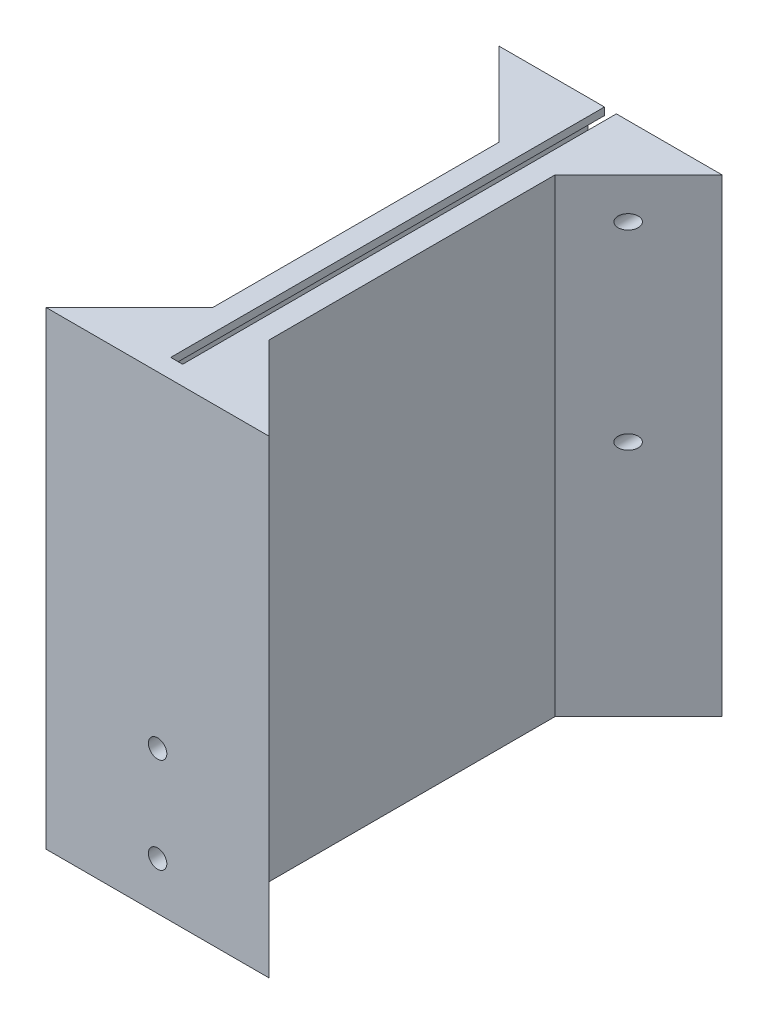
ISO-10303-21;
HEADER;
FILE_DESCRIPTION(('STEP AP214'),'2;1');
FILE_NAME('part.step','',(''),(''),'','','');
FILE_SCHEMA(('AUTOMOTIVE_DESIGN { 1 0 10303 214 1 1 1 1 }'));
ENDSEC;
DATA;
#1=APPLICATION_CONTEXT('core data for automotive mechanical design processes');
#2=APPLICATION_PROTOCOL_DEFINITION('international standard','automotive_design',2000,#1);
#3=PRODUCT_CONTEXT('',#1,'mechanical');
#4=PRODUCT('Part','Part','',(#3));
#5=PRODUCT_RELATED_PRODUCT_CATEGORY('part','',(#4));
#6=PRODUCT_DEFINITION_FORMATION('','',#4);
#7=PRODUCT_DEFINITION_CONTEXT('part definition',#1,'design');
#8=PRODUCT_DEFINITION('design','',#6,#7);
#9=PRODUCT_DEFINITION_SHAPE('','',#8);
#10=(LENGTH_UNIT() NAMED_UNIT(*) SI_UNIT(.MILLI.,.METRE.));
#11=(NAMED_UNIT(*) PLANE_ANGLE_UNIT() SI_UNIT($,.RADIAN.));
#12=(NAMED_UNIT(*) SI_UNIT($,.STERADIAN.) SOLID_ANGLE_UNIT());
#13=UNCERTAINTY_MEASURE_WITH_UNIT(LENGTH_MEASURE(1.E-05),#10,'distance_accuracy_value','');
#14=(GEOMETRIC_REPRESENTATION_CONTEXT(3) GLOBAL_UNCERTAINTY_ASSIGNED_CONTEXT((#13)) GLOBAL_UNIT_ASSIGNED_CONTEXT((#10,
#11,#12)) REPRESENTATION_CONTEXT('',''));
#15=CARTESIAN_POINT('',(0.,0.,0.));
#16=DIRECTION('',(0.,0.,1.));
#17=DIRECTION('',(1.,0.,0.));
#18=AXIS2_PLACEMENT_3D('',#15,#16,#17);
#19=CARTESIAN_POINT('',(-5.99999999999999,123.,55.245));
#20=DIRECTION('',(0.,1.,0.));
#21=DIRECTION('',(0.,0.,1.));
#22=AXIS2_PLACEMENT_3D('',#19,#20,#21);
#23=PLANE('',#22);
#24=DIRECTION('',(1.,0.,0.));
#25=VECTOR('',#24,1.);
#26=CARTESIAN_POINT('',(-5.99999999999999,123.,55.245));
#27=LINE('',#26,#25);
#28=CARTESIAN_POINT('',(1.58750000000001,123.,55.245));
#29=VERTEX_POINT('',#28);
#30=CARTESIAN_POINT('',(6.00000000000001,123.,55.245));
#31=VERTEX_POINT('',#30);
#32=EDGE_CURVE('E224',#29,#31,#27,.T.);
#33=ORIENTED_EDGE('',*,*,#32,.F.);
#34=DIRECTION('',(0.,0.,-1.));
#35=VECTOR('',#34,1.);
#36=CARTESIAN_POINT('',(1.58750000000001,123.,55.245));
#37=LINE('',#36,#35);
#38=CARTESIAN_POINT('',(1.58750000000001,123.,-60.325));
#39=VERTEX_POINT('',#38);
#40=EDGE_CURVE('E216',#29,#39,#37,.T.);
#41=ORIENTED_EDGE('',*,*,#40,.T.);
#42=DIRECTION('',(1.,0.,0.));
#43=VECTOR('',#42,1.);
#44=CARTESIAN_POINT('',(-5.99999999999999,123.,-60.325));
#45=LINE('',#44,#43);
#46=CARTESIAN_POINT('',(6.00000000000001,123.,-60.325));
#47=VERTEX_POINT('',#46);
#48=EDGE_CURVE('E219',#39,#47,#45,.T.);
#49=ORIENTED_EDGE('',*,*,#48,.T.);
#50=DIRECTION('',(0.,0.,-1.));
#51=VECTOR('',#50,1.);
#52=CARTESIAN_POINT('',(6.00000000000001,123.,55.245));
#53=LINE('',#52,#51);
#54=EDGE_CURVE('E233',#31,#47,#53,.T.);
#55=ORIENTED_EDGE('',*,*,#54,.F.);
#56=EDGE_LOOP('',(#33,#41,#49,#55));
#57=FACE_BOUND('',#56,.T.);
#58=ADVANCED_FACE('F32',(#57),#23,.F.);
#59=CARTESIAN_POINT('',(-7.5,125.,38.1));
#60=DIRECTION('',(0.707106781186547,0.,0.707106781186548));
#61=DIRECTION('',(0.707106781186548,0.,-0.707106781186547));
#62=AXIS2_PLACEMENT_3D('',#59,#60,#61);
#63=PLANE('',#62);
#64=DIRECTION('',(-0.707106781186548,0.,0.707106781186547));
#65=VECTOR('',#64,1.);
#66=CARTESIAN_POINT('',(-7.5,0.,38.1));
#67=LINE('',#66,#65);
#68=CARTESIAN_POINT('',(-7.5,0.,38.1));
#69=VERTEX_POINT('',#68);
#70=CARTESIAN_POINT('',(-29.725,0.,60.325));
#71=VERTEX_POINT('',#70);
#72=EDGE_CURVE('E248',#69,#71,#67,.T.);
#73=ORIENTED_EDGE('',*,*,#72,.T.);
#74=DIRECTION('',(0.,-1.,0.));
#75=VECTOR('',#74,1.);
#76=CARTESIAN_POINT('',(-29.725,125.,60.325));
#77=LINE('',#76,#75);
#78=CARTESIAN_POINT('',(-29.725,125.,60.325));
#79=VERTEX_POINT('',#78);
#80=EDGE_CURVE('E11',#79,#71,#77,.T.);
#81=ORIENTED_EDGE('',*,*,#80,.F.);
#82=DIRECTION('',(-0.707106781186548,0.,0.707106781186547));
#83=VECTOR('',#82,1.);
#84=CARTESIAN_POINT('',(-7.5,125.,38.1));
#85=LINE('',#84,#83);
#86=CARTESIAN_POINT('',(-7.5,125.,38.1));
#87=VERTEX_POINT('',#86);
#88=EDGE_CURVE('E255',#87,#79,#85,.T.);
#89=ORIENTED_EDGE('',*,*,#88,.F.);
#90=DIRECTION('',(0.,-1.,0.));
#91=VECTOR('',#90,1.);
#92=CARTESIAN_POINT('',(-7.5,125.,38.1));
#93=LINE('',#92,#91);
#94=EDGE_CURVE('E275',#87,#69,#93,.T.);
#95=ORIENTED_EDGE('',*,*,#94,.T.);
#96=EDGE_LOOP('',(#73,#81,#89,#95));
#97=FACE_BOUND('',#96,.T.);
#98=ADVANCED_FACE('F34',(#97),#63,.F.);
#99=CARTESIAN_POINT('',(-29.725,125.,60.325));
#100=DIRECTION('',(0.,0.,-1.));
#101=DIRECTION('',(-1.,0.,0.));
#102=AXIS2_PLACEMENT_3D('',#99,#100,#101);
#103=PLANE('',#102);
#104=CARTESIAN_POINT('',(0.,12.7,60.325));
#105=DIRECTION('',(0.,0.,1.));
#106=DIRECTION('',(1.,0.,0.));
#107=AXIS2_PLACEMENT_3D('',#104,#105,#106);
#108=CIRCLE('',#107,2.45745);
#109=CARTESIAN_POINT('',(2.45745,12.7,60.325));
#110=VERTEX_POINT('',#109);
#111=EDGE_CURVE('E427',#110,#110,#108,.T.);
#112=ORIENTED_EDGE('',*,*,#111,.F.);
#113=EDGE_LOOP('',(#112));
#114=FACE_BOUND('',#113,.T.);
#115=CARTESIAN_POINT('',(0.,38.1,60.325));
#116=DIRECTION('',(0.,0.,1.));
#117=DIRECTION('',(1.,0.,0.));
#118=AXIS2_PLACEMENT_3D('',#115,#116,#117);
#119=CIRCLE('',#118,2.45745);
#120=CARTESIAN_POINT('',(2.45745,38.1,60.325));
#121=VERTEX_POINT('',#120);
#122=EDGE_CURVE('E430',#121,#121,#119,.T.);
#123=ORIENTED_EDGE('',*,*,#122,.F.);
#124=EDGE_LOOP('',(#123));
#125=FACE_BOUND('',#124,.T.);
#126=DIRECTION('',(1.,0.,0.));
#127=VECTOR('',#126,1.);
#128=CARTESIAN_POINT('',(-29.725,0.,60.325));
#129=LINE('',#128,#127);
#130=CARTESIAN_POINT('',(29.725,0.,60.325));
#131=VERTEX_POINT('',#130);
#132=EDGE_CURVE('E278',#71,#131,#129,.T.);
#133=ORIENTED_EDGE('',*,*,#132,.T.);
#134=DIRECTION('',(0.,-1.,0.));
#135=VECTOR('',#134,1.);
#136=CARTESIAN_POINT('',(29.725,125.,60.325));
#137=LINE('',#136,#135);
#138=CARTESIAN_POINT('',(29.725,125.,60.325));
#139=VERTEX_POINT('',#138);
#140=EDGE_CURVE('E40',#139,#131,#137,.T.);
#141=ORIENTED_EDGE('',*,*,#140,.F.);
#142=DIRECTION('',(1.,0.,0.));
#143=VECTOR('',#142,1.);
#144=CARTESIAN_POINT('',(-29.725,125.,60.325));
#145=LINE('',#144,#143);
#146=EDGE_CURVE('E258',#79,#139,#145,.T.);
#147=ORIENTED_EDGE('',*,*,#146,.F.);
#148=ORIENTED_EDGE('',*,*,#80,.T.);
#149=EDGE_LOOP('',(#133,#141,#147,#148));
#150=FACE_BOUND('',#149,.T.);
#151=ADVANCED_FACE('F335',(#114,#125,#150),#103,.F.);
#152=CARTESIAN_POINT('',(29.725,125.,60.325));
#153=DIRECTION('',(-0.707106781186548,0.,0.707106781186547));
#154=DIRECTION('',(0.707106781186547,0.,0.707106781186548));
#155=AXIS2_PLACEMENT_3D('',#152,#153,#154);
#156=PLANE('',#155);
#157=DIRECTION('',(-0.707106781186547,0.,-0.707106781186548));
#158=VECTOR('',#157,1.);
#159=CARTESIAN_POINT('',(29.725,0.,60.325));
#160=LINE('',#159,#158);
#161=CARTESIAN_POINT('',(7.5,0.,38.1));
#162=VERTEX_POINT('',#161);
#163=EDGE_CURVE('E280',#131,#162,#160,.T.);
#164=ORIENTED_EDGE('',*,*,#163,.T.);
#165=DIRECTION('',(0.,-1.,0.));
#166=VECTOR('',#165,1.);
#167=CARTESIAN_POINT('',(7.5,125.,38.1));
#168=LINE('',#167,#166);
#169=CARTESIAN_POINT('',(7.5,125.,38.1));
#170=VERTEX_POINT('',#169);
#171=EDGE_CURVE('E305',#170,#162,#168,.T.);
#172=ORIENTED_EDGE('',*,*,#171,.F.);
#173=DIRECTION('',(-0.707106781186547,0.,-0.707106781186548));
#174=VECTOR('',#173,1.);
#175=CARTESIAN_POINT('',(29.725,125.,60.325));
#176=LINE('',#175,#174);
#177=EDGE_CURVE('E261',#139,#170,#176,.T.);
#178=ORIENTED_EDGE('',*,*,#177,.F.);
#179=ORIENTED_EDGE('',*,*,#140,.T.);
#180=EDGE_LOOP('',(#164,#172,#178,#179));
#181=FACE_BOUND('',#180,.T.);
#182=ADVANCED_FACE('F312',(#181),#156,.F.);
#183=CARTESIAN_POINT('',(7.5,125.,38.1));
#184=DIRECTION('',(-1.,0.,0.));
#185=DIRECTION('',(0.,0.,1.));
#186=AXIS2_PLACEMENT_3D('',#183,#184,#185);
#187=PLANE('',#186);
#188=DIRECTION('',(0.,0.,-1.));
#189=VECTOR('',#188,1.);
#190=CARTESIAN_POINT('',(7.5,0.,38.1));
#191=LINE('',#190,#189);
#192=CARTESIAN_POINT('',(7.5,0.,-38.1));
#193=VERTEX_POINT('',#192);
#194=EDGE_CURVE('E282',#162,#193,#191,.T.);
#195=ORIENTED_EDGE('',*,*,#194,.T.);
#196=DIRECTION('',(0.,-1.,0.));
#197=VECTOR('',#196,1.);
#198=CARTESIAN_POINT('',(7.5,125.,-38.1));
#199=LINE('',#198,#197);
#200=CARTESIAN_POINT('',(7.5,125.,-38.1));
#201=VERTEX_POINT('',#200);
#202=EDGE_CURVE('E302',#201,#193,#199,.T.);
#203=ORIENTED_EDGE('',*,*,#202,.F.);
#204=DIRECTION('',(0.,0.,-1.));
#205=VECTOR('',#204,1.);
#206=CARTESIAN_POINT('',(7.5,125.,38.1));
#207=LINE('',#206,#205);
#208=EDGE_CURVE('E263',#170,#201,#207,.T.);
#209=ORIENTED_EDGE('',*,*,#208,.F.);
#210=ORIENTED_EDGE('',*,*,#171,.T.);
#211=EDGE_LOOP('',(#195,#203,#209,#210));
#212=FACE_BOUND('',#211,.T.);
#213=ADVANCED_FACE('F323',(#212),#187,.F.);
#214=CARTESIAN_POINT('',(7.5,125.,-38.1));
#215=DIRECTION('',(-0.707106781186547,0.,-0.707106781186548));
#216=DIRECTION('',(-0.707106781186548,0.,0.707106781186547));
#217=AXIS2_PLACEMENT_3D('',#214,#215,#216);
#218=PLANE('',#217);
#219=CARTESIAN_POINT('',(17.225,114.15,-47.825));
#220=DIRECTION('',(-0.707106781186547,0.,-0.707106781186548));
#221=DIRECTION('',(0.707106781186548,0.,-0.707106781186547));
#222=AXIS2_PLACEMENT_3D('',#219,#220,#221);
#223=ELLIPSE('',#222,2.68509658019967,1.89864999999999);
#224=CARTESIAN_POINT('',(19.12365,114.15,-49.72365));
#225=VERTEX_POINT('',#224);
#226=EDGE_CURVE('E662',#225,#225,#223,.T.);
#227=ORIENTED_EDGE('',*,*,#226,.T.);
#228=EDGE_LOOP('',(#227));
#229=FACE_BOUND('',#228,.T.);
#230=CARTESIAN_POINT('',(17.225,63.35,-47.825));
#231=DIRECTION('',(-0.707106781186547,0.,-0.707106781186548));
#232=DIRECTION('',(0.707106781186548,0.,-0.707106781186547));
#233=AXIS2_PLACEMENT_3D('',#230,#231,#232);
#234=ELLIPSE('',#233,2.68509658019967,1.89864999999999);
#235=CARTESIAN_POINT('',(19.12365,63.35,-49.72365));
#236=VERTEX_POINT('',#235);
#237=EDGE_CURVE('E666',#236,#236,#234,.T.);
#238=ORIENTED_EDGE('',*,*,#237,.T.);
#239=EDGE_LOOP('',(#238));
#240=FACE_BOUND('',#239,.T.);
#241=DIRECTION('',(0.707106781186548,0.,-0.707106781186547));
#242=VECTOR('',#241,1.);
#243=CARTESIAN_POINT('',(7.5,0.,-38.1));
#244=LINE('',#243,#242);
#245=CARTESIAN_POINT('',(29.725,0.,-60.325));
#246=VERTEX_POINT('',#245);
#247=EDGE_CURVE('E284',#193,#246,#244,.T.);
#248=ORIENTED_EDGE('',*,*,#247,.T.);
#249=DIRECTION('',(0.,-1.,0.));
#250=VECTOR('',#249,1.);
#251=CARTESIAN_POINT('',(29.725,125.,-60.325));
#252=LINE('',#251,#250);
#253=CARTESIAN_POINT('',(29.725,125.,-60.325));
#254=VERTEX_POINT('',#253);
#255=EDGE_CURVE('E299',#254,#246,#252,.T.);
#256=ORIENTED_EDGE('',*,*,#255,.F.);
#257=DIRECTION('',(0.707106781186548,0.,-0.707106781186547));
#258=VECTOR('',#257,1.);
#259=CARTESIAN_POINT('',(7.5,125.,-38.1));
#260=LINE('',#259,#258);
#261=EDGE_CURVE('E265',#201,#254,#260,.T.);
#262=ORIENTED_EDGE('',*,*,#261,.F.);
#263=ORIENTED_EDGE('',*,*,#202,.T.);
#264=EDGE_LOOP('',(#248,#256,#262,#263));
#265=FACE_BOUND('',#264,.T.);
#266=ADVANCED_FACE('F327',(#229,#240,#265),#218,.F.);
#267=CARTESIAN_POINT('',(29.725,125.,-60.325));
#268=DIRECTION('',(0.,0.,1.));
#269=DIRECTION('',(1.,0.,0.));
#270=AXIS2_PLACEMENT_3D('',#267,#268,#269);
#271=PLANE('',#270);
#272=CARTESIAN_POINT('',(17.225,114.15,-60.325));
#273=DIRECTION('',(0.,0.,-1.));
#274=DIRECTION('',(-1.,0.,0.));
#275=AXIS2_PLACEMENT_3D('',#272,#273,#274);
#276=CIRCLE('',#275,1.89864999999999);
#277=CARTESIAN_POINT('',(15.32635,114.15,-60.325));
#278=VERTEX_POINT('',#277);
#279=EDGE_CURVE('E659',#278,#278,#276,.T.);
#280=ORIENTED_EDGE('',*,*,#279,.F.);
#281=EDGE_LOOP('',(#280));
#282=FACE_BOUND('',#281,.T.);
#283=CARTESIAN_POINT('',(17.225,63.35,-60.325));
#284=DIRECTION('',(0.,0.,-1.));
#285=DIRECTION('',(-1.,0.,0.));
#286=AXIS2_PLACEMENT_3D('',#283,#284,#285);
#287=CIRCLE('',#286,1.89864999999999);
#288=CARTESIAN_POINT('',(15.32635,63.35,-60.325));
#289=VERTEX_POINT('',#288);
#290=EDGE_CURVE('E663',#289,#289,#287,.T.);
#291=ORIENTED_EDGE('',*,*,#290,.F.);
#292=EDGE_LOOP('',(#291));
#293=FACE_BOUND('',#292,.T.);
#294=CARTESIAN_POINT('',(-17.225,114.15,-60.325));
#295=DIRECTION('',(0.,0.,-1.));
#296=DIRECTION('',(-1.,0.,0.));
#297=AXIS2_PLACEMENT_3D('',#294,#295,#296);
#298=CIRCLE('',#297,1.89864999999999);
#299=CARTESIAN_POINT('',(-19.1236499999999,114.15,-60.325));
#300=VERTEX_POINT('',#299);
#301=EDGE_CURVE('E672',#300,#300,#298,.T.);
#302=ORIENTED_EDGE('',*,*,#301,.F.);
#303=EDGE_LOOP('',(#302));
#304=FACE_BOUND('',#303,.T.);
#305=CARTESIAN_POINT('',(-17.225,63.35,-60.325));
#306=DIRECTION('',(0.,0.,-1.));
#307=DIRECTION('',(-1.,0.,0.));
#308=AXIS2_PLACEMENT_3D('',#305,#306,#307);
#309=CIRCLE('',#308,1.89864999999999);
#310=CARTESIAN_POINT('',(-19.1236499999999,63.35,-60.325));
#311=VERTEX_POINT('',#310);
#312=EDGE_CURVE('E678',#311,#311,#309,.T.);
#313=ORIENTED_EDGE('',*,*,#312,.F.);
#314=EDGE_LOOP('',(#313));
#315=FACE_BOUND('',#314,.T.);
#316=CARTESIAN_POINT('',(0.,38.1,-60.325));
#317=DIRECTION('',(0.,0.,-1.));
#318=DIRECTION('',(-1.,0.,0.));
#319=AXIS2_PLACEMENT_3D('',#316,#317,#318);
#320=CIRCLE('',#319,2.45745);
#321=CARTESIAN_POINT('',(-2.45745,38.1,-60.325));
#322=VERTEX_POINT('',#321);
#323=EDGE_CURVE('E436',#322,#322,#320,.T.);
#324=ORIENTED_EDGE('',*,*,#323,.F.);
#325=EDGE_LOOP('',(#324));
#326=FACE_BOUND('',#325,.T.);
#327=CARTESIAN_POINT('',(0.,12.7,-60.325));
#328=DIRECTION('',(0.,0.,-1.));
#329=DIRECTION('',(-1.,0.,0.));
#330=AXIS2_PLACEMENT_3D('',#327,#328,#329);
#331=CIRCLE('',#330,2.45745);
#332=CARTESIAN_POINT('',(-2.45745,12.7,-60.325));
#333=VERTEX_POINT('',#332);
#334=EDGE_CURVE('E445',#333,#333,#331,.T.);
#335=ORIENTED_EDGE('',*,*,#334,.F.);
#336=EDGE_LOOP('',(#335));
#337=FACE_BOUND('',#336,.T.);
#338=ORIENTED_EDGE('',*,*,#48,.F.);
#339=DIRECTION('',(0.,1.,0.));
#340=VECTOR('',#339,1.);
#341=CARTESIAN_POINT('',(1.58750000000001,122.,-60.325));
#342=LINE('',#341,#340);
#343=CARTESIAN_POINT('',(1.58750000000001,125.,-60.325));
#344=VERTEX_POINT('',#343);
#345=EDGE_CURVE('E205',#39,#344,#342,.T.);
#346=ORIENTED_EDGE('',*,*,#345,.T.);
#347=DIRECTION('',(-1.,0.,0.));
#348=VECTOR('',#347,1.);
#349=CARTESIAN_POINT('',(29.725,125.,-60.325));
#350=LINE('',#349,#348);
#351=EDGE_CURVE('E268',#254,#344,#350,.T.);
#352=ORIENTED_EDGE('',*,*,#351,.F.);
#353=ORIENTED_EDGE('',*,*,#255,.T.);
#354=DIRECTION('',(-1.,0.,0.));
#355=VECTOR('',#354,1.);
#356=CARTESIAN_POINT('',(29.725,0.,-60.325));
#357=LINE('',#356,#355);
#358=CARTESIAN_POINT('',(-29.725,0.,-60.325));
#359=VERTEX_POINT('',#358);
#360=EDGE_CURVE('E286',#246,#359,#357,.T.);
#361=ORIENTED_EDGE('',*,*,#360,.T.);
#362=DIRECTION('',(0.,-1.,0.));
#363=VECTOR('',#362,1.);
#364=CARTESIAN_POINT('',(-29.725,125.,-60.325));
#365=LINE('',#364,#363);
#366=CARTESIAN_POINT('',(-29.725,125.,-60.325));
#367=VERTEX_POINT('',#366);
#368=EDGE_CURVE('E296',#367,#359,#365,.T.);
#369=ORIENTED_EDGE('',*,*,#368,.F.);
#370=CARTESIAN_POINT('',(-1.58750000000001,125.,-60.325));
#371=VERTEX_POINT('',#370);
#372=EDGE_CURVE('E267',#371,#367,#350,.T.);
#373=ORIENTED_EDGE('',*,*,#372,.F.);
#374=DIRECTION('',(0.,1.,0.));
#375=VECTOR('',#374,1.);
#376=CARTESIAN_POINT('',(-1.58750000000001,122.,-60.325));
#377=LINE('',#376,#375);
#378=CARTESIAN_POINT('',(-1.58750000000001,123.,-60.325));
#379=VERTEX_POINT('',#378);
#380=EDGE_CURVE('E204',#379,#371,#377,.T.);
#381=ORIENTED_EDGE('',*,*,#380,.F.);
#382=CARTESIAN_POINT('',(-5.99999999999999,123.,-60.325));
#383=VERTEX_POINT('',#382);
#384=EDGE_CURVE('E234',#383,#379,#45,.T.);
#385=ORIENTED_EDGE('',*,*,#384,.F.);
#386=DIRECTION('',(0.,1.,0.));
#387=VECTOR('',#386,1.);
#388=CARTESIAN_POINT('',(-5.99999999999999,55.,-60.325));
#389=LINE('',#388,#387);
#390=CARTESIAN_POINT('',(-5.99999999999999,55.,-60.325));
#391=VERTEX_POINT('',#390);
#392=EDGE_CURVE('E243',#391,#383,#389,.T.);
#393=ORIENTED_EDGE('',*,*,#392,.F.);
#394=DIRECTION('',(-1.,0.,0.));
#395=VECTOR('',#394,1.);
#396=CARTESIAN_POINT('',(6.00000000000001,55.,-60.325));
#397=LINE('',#396,#395);
#398=CARTESIAN_POINT('',(6.00000000000001,55.,-60.325));
#399=VERTEX_POINT('',#398);
#400=EDGE_CURVE('E240',#399,#391,#397,.T.);
#401=ORIENTED_EDGE('',*,*,#400,.F.);
#402=DIRECTION('',(0.,-1.,0.));
#403=VECTOR('',#402,1.);
#404=CARTESIAN_POINT('',(6.00000000000001,123.,-60.325));
#405=LINE('',#404,#403);
#406=EDGE_CURVE('E237',#47,#399,#405,.T.);
#407=ORIENTED_EDGE('',*,*,#406,.F.);
#408=EDGE_LOOP('',(#338,#346,#352,#353,#361,#369,#373,#381,#385,#393,#401,#407));
#409=FACE_BOUND('',#408,.T.);
#410=ADVANCED_FACE('F351',(#282,#293,#304,#315,#326,#337,#409),#271,.F.);
#411=CARTESIAN_POINT('',(-29.725,125.,-60.325));
#412=DIRECTION('',(0.707106781186548,0.,-0.707106781186547));
#413=DIRECTION('',(-0.707106781186547,0.,-0.707106781186548));
#414=AXIS2_PLACEMENT_3D('',#411,#412,#413);
#415=PLANE('',#414);
#416=CARTESIAN_POINT('',(-17.225,114.15,-47.825));
#417=DIRECTION('',(0.707106781186548,0.,-0.707106781186547));
#418=DIRECTION('',(-0.707106781186547,0.,-0.707106781186548));
#419=AXIS2_PLACEMENT_3D('',#416,#417,#418);
#420=ELLIPSE('',#419,2.68509658019967,1.89864999999999);
#421=CARTESIAN_POINT('',(-19.1236499999999,114.15,-49.72365));
#422=VERTEX_POINT('',#421);
#423=EDGE_CURVE('E675',#422,#422,#420,.T.);
#424=ORIENTED_EDGE('',*,*,#423,.T.);
#425=EDGE_LOOP('',(#424));
#426=FACE_BOUND('',#425,.T.);
#427=CARTESIAN_POINT('',(-17.225,63.35,-47.825));
#428=DIRECTION('',(0.707106781186548,0.,-0.707106781186547));
#429=DIRECTION('',(-0.707106781186547,0.,-0.707106781186548));
#430=AXIS2_PLACEMENT_3D('',#427,#428,#429);
#431=ELLIPSE('',#430,2.68509658019967,1.89864999999999);
#432=CARTESIAN_POINT('',(-19.1236499999999,63.35,-49.72365));
#433=VERTEX_POINT('',#432);
#434=EDGE_CURVE('E681',#433,#433,#431,.T.);
#435=ORIENTED_EDGE('',*,*,#434,.T.);
#436=EDGE_LOOP('',(#435));
#437=FACE_BOUND('',#436,.T.);
#438=DIRECTION('',(0.707106781186547,0.,0.707106781186548));
#439=VECTOR('',#438,1.);
#440=CARTESIAN_POINT('',(-29.725,0.,-60.325));
#441=LINE('',#440,#439);
#442=CARTESIAN_POINT('',(-7.5,0.,-38.1));
#443=VERTEX_POINT('',#442);
#444=EDGE_CURVE('E288',#359,#443,#441,.T.);
#445=ORIENTED_EDGE('',*,*,#444,.T.);
#446=DIRECTION('',(0.,-1.,0.));
#447=VECTOR('',#446,1.);
#448=CARTESIAN_POINT('',(-7.5,125.,-38.1));
#449=LINE('',#448,#447);
#450=CARTESIAN_POINT('',(-7.5,125.,-38.1));
#451=VERTEX_POINT('',#450);
#452=EDGE_CURVE('E293',#451,#443,#449,.T.);
#453=ORIENTED_EDGE('',*,*,#452,.F.);
#454=DIRECTION('',(0.707106781186547,0.,0.707106781186548));
#455=VECTOR('',#454,1.);
#456=CARTESIAN_POINT('',(-29.725,125.,-60.325));
#457=LINE('',#456,#455);
#458=EDGE_CURVE('E271',#367,#451,#457,.T.);
#459=ORIENTED_EDGE('',*,*,#458,.F.);
#460=ORIENTED_EDGE('',*,*,#368,.T.);
#461=EDGE_LOOP('',(#445,#453,#459,#460));
#462=FACE_BOUND('',#461,.T.);
#463=ADVANCED_FACE('F346',(#426,#437,#462),#415,.F.);
#464=CARTESIAN_POINT('',(-7.5,125.,-38.1));
#465=DIRECTION('',(1.,0.,0.));
#466=DIRECTION('',(0.,0.,-1.));
#467=AXIS2_PLACEMENT_3D('',#464,#465,#466);
#468=PLANE('',#467);
#469=DIRECTION('',(0.,0.,1.));
#470=VECTOR('',#469,1.);
#471=CARTESIAN_POINT('',(-7.5,0.,-38.1));
#472=LINE('',#471,#470);
#473=EDGE_CURVE('E259',#443,#69,#472,.T.);
#474=ORIENTED_EDGE('',*,*,#473,.T.);
#475=ORIENTED_EDGE('',*,*,#94,.F.);
#476=DIRECTION('',(0.,0.,1.));
#477=VECTOR('',#476,1.);
#478=CARTESIAN_POINT('',(-7.5,125.,-38.1));
#479=LINE('',#478,#477);
#480=EDGE_CURVE('E273',#451,#87,#479,.T.);
#481=ORIENTED_EDGE('',*,*,#480,.F.);
#482=ORIENTED_EDGE('',*,*,#452,.T.);
#483=EDGE_LOOP('',(#474,#475,#481,#482));
#484=FACE_BOUND('',#483,.T.);
#485=ADVANCED_FACE('F341',(#484),#468,.F.);
#486=CARTESIAN_POINT('',(0.,125.,0.));
#487=DIRECTION('',(0.,-1.,0.));
#488=DIRECTION('',(0.,0.,-1.));
#489=AXIS2_PLACEMENT_3D('',#486,#487,#488);
#490=PLANE('',#489);
#491=ORIENTED_EDGE('',*,*,#351,.T.);
#492=DIRECTION('',(0.,0.,-1.));
#493=VECTOR('',#492,1.);
#494=CARTESIAN_POINT('',(1.58750000000001,125.,55.245));
#495=LINE('',#494,#493);
#496=CARTESIAN_POINT('',(1.58750000000001,125.,55.245));
#497=VERTEX_POINT('',#496);
#498=EDGE_CURVE('E202',#497,#344,#495,.T.);
#499=ORIENTED_EDGE('',*,*,#498,.F.);
#500=DIRECTION('',(1.,0.,0.));
#501=VECTOR('',#500,1.);
#502=CARTESIAN_POINT('',(-1.58749999999999,125.,55.245));
#503=LINE('',#502,#501);
#504=CARTESIAN_POINT('',(-1.58749999999999,125.,55.245));
#505=VERTEX_POINT('',#504);
#506=EDGE_CURVE('E199',#505,#497,#503,.T.);
#507=ORIENTED_EDGE('',*,*,#506,.F.);
#508=DIRECTION('',(0.,0.,1.));
#509=VECTOR('',#508,1.);
#510=CARTESIAN_POINT('',(-1.58750000000001,125.,-60.325));
#511=LINE('',#510,#509);
#512=EDGE_CURVE('E196',#371,#505,#511,.T.);
#513=ORIENTED_EDGE('',*,*,#512,.F.);
#514=ORIENTED_EDGE('',*,*,#372,.T.);
#515=ORIENTED_EDGE('',*,*,#458,.T.);
#516=ORIENTED_EDGE('',*,*,#480,.T.);
#517=ORIENTED_EDGE('',*,*,#88,.T.);
#518=ORIENTED_EDGE('',*,*,#146,.T.);
#519=ORIENTED_EDGE('',*,*,#177,.T.);
#520=ORIENTED_EDGE('',*,*,#208,.T.);
#521=ORIENTED_EDGE('',*,*,#261,.T.);
#522=EDGE_LOOP('',(#491,#499,#507,#513,#514,#515,#516,#517,#518,#519,#520,#521));
#523=FACE_BOUND('',#522,.T.);
#524=ADVANCED_FACE('F331',(#523),#490,.F.);
#525=CARTESIAN_POINT('',(0.,0.,0.));
#526=DIRECTION('',(0.,-1.,0.));
#527=DIRECTION('',(0.,0.,-1.));
#528=AXIS2_PLACEMENT_3D('',#525,#526,#527);
#529=PLANE('',#528);
#530=DIRECTION('',(0.,0.,1.));
#531=VECTOR('',#530,1.);
#532=CARTESIAN_POINT('',(4.,0.,-9.525));
#533=LINE('',#532,#531);
#534=CARTESIAN_POINT('',(4.,0.,-9.525));
#535=VERTEX_POINT('',#534);
#536=CARTESIAN_POINT('',(4.,0.,9.525));
#537=VERTEX_POINT('',#536);
#538=EDGE_CURVE('E459',#535,#537,#533,.T.);
#539=ORIENTED_EDGE('',*,*,#538,.F.);
#540=DIRECTION('',(1.,0.,0.));
#541=VECTOR('',#540,1.);
#542=CARTESIAN_POINT('',(-4.,0.,-9.525));
#543=LINE('',#542,#541);
#544=CARTESIAN_POINT('',(-4.,0.,-9.525));
#545=VERTEX_POINT('',#544);
#546=EDGE_CURVE('E189',#545,#535,#543,.T.);
#547=ORIENTED_EDGE('',*,*,#546,.F.);
#548=DIRECTION('',(0.,0.,-1.));
#549=VECTOR('',#548,1.);
#550=CARTESIAN_POINT('',(-4.,0.,-9.525));
#551=LINE('',#550,#549);
#552=CARTESIAN_POINT('',(-4.,0.,9.525));
#553=VERTEX_POINT('',#552);
#554=EDGE_CURVE('E47',#553,#545,#551,.T.);
#555=ORIENTED_EDGE('',*,*,#554,.F.);
#556=DIRECTION('',(-1.,0.,0.));
#557=VECTOR('',#556,1.);
#558=CARTESIAN_POINT('',(4.,0.,9.525));
#559=LINE('',#558,#557);
#560=EDGE_CURVE('E456',#537,#553,#559,.T.);
#561=ORIENTED_EDGE('',*,*,#560,.F.);
#562=EDGE_LOOP('',(#539,#547,#555,#561));
#563=FACE_BOUND('',#562,.T.);
#564=ORIENTED_EDGE('',*,*,#72,.F.);
#565=ORIENTED_EDGE('',*,*,#473,.F.);
#566=ORIENTED_EDGE('',*,*,#444,.F.);
#567=ORIENTED_EDGE('',*,*,#360,.F.);
#568=ORIENTED_EDGE('',*,*,#247,.F.);
#569=ORIENTED_EDGE('',*,*,#194,.F.);
#570=ORIENTED_EDGE('',*,*,#163,.F.);
#571=ORIENTED_EDGE('',*,*,#132,.F.);
#572=EDGE_LOOP('',(#564,#565,#566,#567,#568,#569,#570,#571));
#573=FACE_BOUND('',#572,.T.);
#574=ADVANCED_FACE('F318',(#563,#573),#529,.T.);
#575=ORIENTED_EDGE('',*,*,#384,.T.);
#576=DIRECTION('',(0.,0.,1.));
#577=VECTOR('',#576,1.);
#578=CARTESIAN_POINT('',(-1.58749999999999,123.,55.245));
#579=LINE('',#578,#577);
#580=CARTESIAN_POINT('',(-1.58749999999999,123.,55.245));
#581=VERTEX_POINT('',#580);
#582=EDGE_CURVE('E208',#379,#581,#579,.T.);
#583=ORIENTED_EDGE('',*,*,#582,.T.);
#584=CARTESIAN_POINT('',(-5.99999999999999,123.,55.245));
#585=VERTEX_POINT('',#584);
#586=EDGE_CURVE('E220',#585,#581,#27,.T.);
#587=ORIENTED_EDGE('',*,*,#586,.F.);
#588=DIRECTION('',(0.,0.,-1.));
#589=VECTOR('',#588,1.);
#590=CARTESIAN_POINT('',(-5.99999999999999,123.,55.245));
#591=LINE('',#590,#589);
#592=EDGE_CURVE('E246',#585,#383,#591,.T.);
#593=ORIENTED_EDGE('',*,*,#592,.T.);
#594=EDGE_LOOP('',(#575,#583,#587,#593));
#595=FACE_BOUND('',#594,.T.);
#596=ADVANCED_FACE('F370',(#595),#23,.F.);
#597=CARTESIAN_POINT('',(-5.99999999999999,55.,55.245));
#598=DIRECTION('',(-1.,0.,0.));
#599=DIRECTION('',(0.,0.,1.));
#600=AXIS2_PLACEMENT_3D('',#597,#598,#599);
#601=PLANE('',#600);
#602=ORIENTED_EDGE('',*,*,#392,.T.);
#603=ORIENTED_EDGE('',*,*,#592,.F.);
#604=DIRECTION('',(0.,1.,0.));
#605=VECTOR('',#604,1.);
#606=CARTESIAN_POINT('',(-5.99999999999999,55.,55.245));
#607=LINE('',#606,#605);
#608=CARTESIAN_POINT('',(-5.99999999999999,55.,55.245));
#609=VERTEX_POINT('',#608);
#610=EDGE_CURVE('E230',#609,#585,#607,.T.);
#611=ORIENTED_EDGE('',*,*,#610,.F.);
#612=DIRECTION('',(0.,0.,-1.));
#613=VECTOR('',#612,1.);
#614=CARTESIAN_POINT('',(-5.99999999999999,55.,55.245));
#615=LINE('',#614,#613);
#616=EDGE_CURVE('E249',#609,#391,#615,.T.);
#617=ORIENTED_EDGE('',*,*,#616,.T.);
#618=EDGE_LOOP('',(#602,#603,#611,#617));
#619=FACE_BOUND('',#618,.T.);
#620=ADVANCED_FACE('F374',(#619),#601,.F.);
#621=CARTESIAN_POINT('',(6.00000000000001,55.,55.245));
#622=DIRECTION('',(0.,-1.,0.));
#623=DIRECTION('',(0.,0.,-1.));
#624=AXIS2_PLACEMENT_3D('',#621,#622,#623);
#625=PLANE('',#624);
#626=DIRECTION('',(-1.,0.,0.));
#627=VECTOR('',#626,1.);
#628=CARTESIAN_POINT('',(-4.,55.,-9.525));
#629=LINE('',#628,#627);
#630=CARTESIAN_POINT('',(4.,55.,-9.525));
#631=VERTEX_POINT('',#630);
#632=CARTESIAN_POINT('',(-4.,55.,-9.525));
#633=VERTEX_POINT('',#632);
#634=EDGE_CURVE('E180',#631,#633,#629,.T.);
#635=ORIENTED_EDGE('',*,*,#634,.F.);
#636=DIRECTION('',(0.,0.,-1.));
#637=VECTOR('',#636,1.);
#638=CARTESIAN_POINT('',(4.,55.,-9.525));
#639=LINE('',#638,#637);
#640=CARTESIAN_POINT('',(4.,55.,9.525));
#641=VERTEX_POINT('',#640);
#642=EDGE_CURVE('E55',#641,#631,#639,.T.);
#643=ORIENTED_EDGE('',*,*,#642,.F.);
#644=DIRECTION('',(1.,0.,0.));
#645=VECTOR('',#644,1.);
#646=CARTESIAN_POINT('',(4.,55.,9.525));
#647=LINE('',#646,#645);
#648=CARTESIAN_POINT('',(-4.,55.,9.525));
#649=VERTEX_POINT('',#648);
#650=EDGE_CURVE('E187',#649,#641,#647,.T.);
#651=ORIENTED_EDGE('',*,*,#650,.F.);
#652=DIRECTION('',(0.,0.,1.));
#653=VECTOR('',#652,1.);
#654=CARTESIAN_POINT('',(-4.,55.,-9.525));
#655=LINE('',#654,#653);
#656=EDGE_CURVE('E171',#633,#649,#655,.T.);
#657=ORIENTED_EDGE('',*,*,#656,.F.);
#658=EDGE_LOOP('',(#635,#643,#651,#657));
#659=FACE_BOUND('',#658,.T.);
#660=ORIENTED_EDGE('',*,*,#400,.T.);
#661=ORIENTED_EDGE('',*,*,#616,.F.);
#662=DIRECTION('',(-1.,0.,0.));
#663=VECTOR('',#662,1.);
#664=CARTESIAN_POINT('',(6.00000000000001,55.,55.245));
#665=LINE('',#664,#663);
#666=CARTESIAN_POINT('',(6.00000000000001,55.,55.245));
#667=VERTEX_POINT('',#666);
#668=EDGE_CURVE('E227',#667,#609,#665,.T.);
#669=ORIENTED_EDGE('',*,*,#668,.F.);
#670=DIRECTION('',(0.,0.,-1.));
#671=VECTOR('',#670,1.);
#672=CARTESIAN_POINT('',(6.00000000000001,55.,55.245));
#673=LINE('',#672,#671);
#674=EDGE_CURVE('E251',#667,#399,#673,.T.);
#675=ORIENTED_EDGE('',*,*,#674,.T.);
#676=EDGE_LOOP('',(#660,#661,#669,#675));
#677=FACE_BOUND('',#676,.T.);
#678=ADVANCED_FACE('F184',(#659,#677),#625,.F.);
#679=CARTESIAN_POINT('',(6.00000000000001,123.,55.245));
#680=DIRECTION('',(1.,0.,0.));
#681=DIRECTION('',(0.,1.,0.));
#682=AXIS2_PLACEMENT_3D('',#679,#680,#681);
#683=PLANE('',#682);
#684=ORIENTED_EDGE('',*,*,#406,.T.);
#685=ORIENTED_EDGE('',*,*,#674,.F.);
#686=DIRECTION('',(0.,-1.,0.));
#687=VECTOR('',#686,1.);
#688=CARTESIAN_POINT('',(6.00000000000001,123.,55.245));
#689=LINE('',#688,#687);
#690=EDGE_CURVE('E223',#31,#667,#689,.T.);
#691=ORIENTED_EDGE('',*,*,#690,.F.);
#692=ORIENTED_EDGE('',*,*,#54,.T.);
#693=EDGE_LOOP('',(#684,#685,#691,#692));
#694=FACE_BOUND('',#693,.T.);
#695=ADVANCED_FACE('F378',(#694),#683,.F.);
#696=CARTESIAN_POINT('',(0.,0.,55.245));
#697=DIRECTION('',(0.,0.,-1.));
#698=DIRECTION('',(-1.,0.,0.));
#699=AXIS2_PLACEMENT_3D('',#696,#697,#698);
#700=PLANE('',#699);
#701=ORIENTED_EDGE('',*,*,#586,.T.);
#702=DIRECTION('',(0.,1.,0.));
#703=VECTOR('',#702,1.);
#704=CARTESIAN_POINT('',(-1.58749999999999,122.,55.245));
#705=LINE('',#704,#703);
#706=EDGE_CURVE('E211',#581,#505,#705,.T.);
#707=ORIENTED_EDGE('',*,*,#706,.T.);
#708=ORIENTED_EDGE('',*,*,#506,.T.);
#709=DIRECTION('',(0.,1.,0.));
#710=VECTOR('',#709,1.);
#711=CARTESIAN_POINT('',(1.58750000000001,122.,55.245));
#712=LINE('',#711,#710);
#713=EDGE_CURVE('E209',#29,#497,#712,.T.);
#714=ORIENTED_EDGE('',*,*,#713,.F.);
#715=ORIENTED_EDGE('',*,*,#32,.T.);
#716=ORIENTED_EDGE('',*,*,#690,.T.);
#717=ORIENTED_EDGE('',*,*,#668,.T.);
#718=ORIENTED_EDGE('',*,*,#610,.T.);
#719=EDGE_LOOP('',(#701,#707,#708,#714,#715,#716,#717,#718));
#720=FACE_BOUND('',#719,.T.);
#721=ADVANCED_FACE('F362',(#720),#700,.T.);
#722=CARTESIAN_POINT('',(1.58750000000001,122.,55.245));
#723=DIRECTION('',(1.,0.,0.));
#724=DIRECTION('',(0.,0.,-1.));
#725=AXIS2_PLACEMENT_3D('',#722,#723,#724);
#726=PLANE('',#725);
#727=ORIENTED_EDGE('',*,*,#713,.T.);
#728=ORIENTED_EDGE('',*,*,#498,.T.);
#729=ORIENTED_EDGE('',*,*,#345,.F.);
#730=ORIENTED_EDGE('',*,*,#40,.F.);
#731=EDGE_LOOP('',(#727,#728,#729,#730));
#732=FACE_BOUND('',#731,.T.);
#733=ADVANCED_FACE('F355',(#732),#726,.F.);
#734=CARTESIAN_POINT('',(-1.58750000000001,122.,-60.325));
#735=DIRECTION('',(-1.,0.,0.));
#736=DIRECTION('',(0.,0.,1.));
#737=AXIS2_PLACEMENT_3D('',#734,#735,#736);
#738=PLANE('',#737);
#739=ORIENTED_EDGE('',*,*,#380,.T.);
#740=ORIENTED_EDGE('',*,*,#512,.T.);
#741=ORIENTED_EDGE('',*,*,#706,.F.);
#742=ORIENTED_EDGE('',*,*,#582,.F.);
#743=EDGE_LOOP('',(#739,#740,#741,#742));
#744=FACE_BOUND('',#743,.T.);
#745=ADVANCED_FACE('F366',(#744),#738,.F.);
#746=CARTESIAN_POINT('',(4.,125.001,-9.525));
#747=DIRECTION('',(1.,0.,0.));
#748=DIRECTION('',(0.,0.,-1.));
#749=AXIS2_PLACEMENT_3D('',#746,#747,#748);
#750=PLANE('',#749);
#751=ORIENTED_EDGE('',*,*,#642,.T.);
#752=DIRECTION('',(0.,-1.,0.));
#753=VECTOR('',#752,1.);
#754=CARTESIAN_POINT('',(4.,125.001,-9.525));
#755=LINE('',#754,#753);
#756=EDGE_CURVE('E176',#631,#535,#755,.T.);
#757=ORIENTED_EDGE('',*,*,#756,.T.);
#758=ORIENTED_EDGE('',*,*,#538,.T.);
#759=DIRECTION('',(0.,-1.,0.));
#760=VECTOR('',#759,1.);
#761=CARTESIAN_POINT('',(4.,125.001,9.525));
#762=LINE('',#761,#760);
#763=EDGE_CURVE('E193',#641,#537,#762,.T.);
#764=ORIENTED_EDGE('',*,*,#763,.F.);
#765=EDGE_LOOP('',(#751,#757,#758,#764));
#766=FACE_BOUND('',#765,.T.);
#767=ADVANCED_FACE('F462',(#766),#750,.F.);
#768=CARTESIAN_POINT('',(4.,125.001,9.525));
#769=DIRECTION('',(0.,0.,1.));
#770=DIRECTION('',(1.,0.,0.));
#771=AXIS2_PLACEMENT_3D('',#768,#769,#770);
#772=PLANE('',#771);
#773=ORIENTED_EDGE('',*,*,#650,.T.);
#774=ORIENTED_EDGE('',*,*,#763,.T.);
#775=ORIENTED_EDGE('',*,*,#560,.T.);
#776=DIRECTION('',(0.,-1.,0.));
#777=VECTOR('',#776,1.);
#778=CARTESIAN_POINT('',(-4.,125.001,9.525));
#779=LINE('',#778,#777);
#780=EDGE_CURVE('E177',#649,#553,#779,.T.);
#781=ORIENTED_EDGE('',*,*,#780,.F.);
#782=EDGE_LOOP('',(#773,#774,#775,#781));
#783=FACE_BOUND('',#782,.T.);
#784=ADVANCED_FACE('F464',(#783),#772,.F.);
#785=CARTESIAN_POINT('',(-4.,125.001,-9.525));
#786=DIRECTION('',(-1.,0.,0.));
#787=DIRECTION('',(0.,0.,1.));
#788=AXIS2_PLACEMENT_3D('',#785,#786,#787);
#789=PLANE('',#788);
#790=ORIENTED_EDGE('',*,*,#656,.T.);
#791=ORIENTED_EDGE('',*,*,#780,.T.);
#792=ORIENTED_EDGE('',*,*,#554,.T.);
#793=DIRECTION('',(0.,-1.,0.));
#794=VECTOR('',#793,1.);
#795=CARTESIAN_POINT('',(-4.,125.001,-9.525));
#796=LINE('',#795,#794);
#797=EDGE_CURVE('E167',#633,#545,#796,.T.);
#798=ORIENTED_EDGE('',*,*,#797,.F.);
#799=EDGE_LOOP('',(#790,#791,#792,#798));
#800=FACE_BOUND('',#799,.T.);
#801=ADVANCED_FACE('F169',(#800),#789,.F.);
#802=CARTESIAN_POINT('',(-4.,125.001,-9.525));
#803=DIRECTION('',(0.,0.,-1.));
#804=DIRECTION('',(-1.,0.,0.));
#805=AXIS2_PLACEMENT_3D('',#802,#803,#804);
#806=PLANE('',#805);
#807=ORIENTED_EDGE('',*,*,#634,.T.);
#808=ORIENTED_EDGE('',*,*,#797,.T.);
#809=ORIENTED_EDGE('',*,*,#546,.T.);
#810=ORIENTED_EDGE('',*,*,#756,.F.);
#811=EDGE_LOOP('',(#807,#808,#809,#810));
#812=FACE_BOUND('',#811,.T.);
#813=ADVANCED_FACE('F181',(#812),#806,.F.);
#814=CARTESIAN_POINT('',(0.,12.7,-34.925));
#815=DIRECTION('',(0.,0.,-1.));
#816=DIRECTION('',(-1.,0.,0.));
#817=AXIS2_PLACEMENT_3D('',#814,#815,#816);
#818=CYLINDRICAL_SURFACE('',#817,2.45745);
#819=CARTESIAN_POINT('',(0.,12.7,-34.925));
#820=DIRECTION('',(0.,0.,-1.));
#821=DIRECTION('',(-1.,0.,0.));
#822=AXIS2_PLACEMENT_3D('',#819,#820,#821);
#823=CIRCLE('',#822,2.45745);
#824=CARTESIAN_POINT('',(-2.45745,12.7,-34.925));
#825=VERTEX_POINT('',#824);
#826=EDGE_CURVE('E448',#825,#825,#823,.T.);
#827=ORIENTED_EDGE('',*,*,#826,.F.);
#828=EDGE_LOOP('',(#827));
#829=FACE_BOUND('',#828,.T.);
#830=ORIENTED_EDGE('',*,*,#334,.T.);
#831=EDGE_LOOP('',(#830));
#832=FACE_BOUND('',#831,.T.);
#833=ADVANCED_FACE('F476',(#829,#832),#818,.F.);
#834=CARTESIAN_POINT('',(0.,12.7,-34.925));
#835=DIRECTION('',(0.,0.,-1.));
#836=DIRECTION('',(-1.,0.,0.));
#837=AXIS2_PLACEMENT_3D('',#834,#835,#836);
#838=PLANE('',#837);
#839=ORIENTED_EDGE('',*,*,#826,.T.);
#840=EDGE_LOOP('',(#839));
#841=FACE_BOUND('',#840,.T.);
#842=ADVANCED_FACE('F517',(#841),#838,.T.);
#843=CARTESIAN_POINT('',(0.,38.1,-34.925));
#844=DIRECTION('',(0.,0.,-1.));
#845=DIRECTION('',(-1.,0.,0.));
#846=AXIS2_PLACEMENT_3D('',#843,#844,#845);
#847=CYLINDRICAL_SURFACE('',#846,2.45745);
#848=CARTESIAN_POINT('',(0.,38.1,-34.925));
#849=DIRECTION('',(0.,0.,-1.));
#850=DIRECTION('',(-1.,0.,0.));
#851=AXIS2_PLACEMENT_3D('',#848,#849,#850);
#852=CIRCLE('',#851,2.45745);
#853=CARTESIAN_POINT('',(-2.45745,38.1,-34.925));
#854=VERTEX_POINT('',#853);
#855=EDGE_CURVE('E442',#854,#854,#852,.T.);
#856=ORIENTED_EDGE('',*,*,#855,.F.);
#857=EDGE_LOOP('',(#856));
#858=FACE_BOUND('',#857,.T.);
#859=ORIENTED_EDGE('',*,*,#323,.T.);
#860=EDGE_LOOP('',(#859));
#861=FACE_BOUND('',#860,.T.);
#862=ADVANCED_FACE('F526',(#858,#861),#847,.F.);
#863=CARTESIAN_POINT('',(0.,38.1,-34.925));
#864=DIRECTION('',(0.,0.,-1.));
#865=DIRECTION('',(-1.,0.,0.));
#866=AXIS2_PLACEMENT_3D('',#863,#864,#865);
#867=PLANE('',#866);
#868=ORIENTED_EDGE('',*,*,#855,.T.);
#869=EDGE_LOOP('',(#868));
#870=FACE_BOUND('',#869,.T.);
#871=ADVANCED_FACE('F536',(#870),#867,.T.);
#872=CARTESIAN_POINT('',(0.,38.1,34.925));
#873=DIRECTION('',(0.,0.,1.));
#874=DIRECTION('',(1.,0.,0.));
#875=AXIS2_PLACEMENT_3D('',#872,#873,#874);
#876=CYLINDRICAL_SURFACE('',#875,2.45745);
#877=CARTESIAN_POINT('',(0.,38.1,34.925));
#878=DIRECTION('',(0.,0.,1.));
#879=DIRECTION('',(1.,0.,0.));
#880=AXIS2_PLACEMENT_3D('',#877,#878,#879);
#881=CIRCLE('',#880,2.45745);
#882=CARTESIAN_POINT('',(2.45745,38.1,34.925));
#883=VERTEX_POINT('',#882);
#884=EDGE_CURVE('E432',#883,#883,#881,.T.);
#885=ORIENTED_EDGE('',*,*,#884,.F.);
#886=EDGE_LOOP('',(#885));
#887=FACE_BOUND('',#886,.T.);
#888=ORIENTED_EDGE('',*,*,#122,.T.);
#889=EDGE_LOOP('',(#888));
#890=FACE_BOUND('',#889,.T.);
#891=ADVANCED_FACE('F545',(#887,#890),#876,.F.);
#892=CARTESIAN_POINT('',(0.,38.1,34.925));
#893=DIRECTION('',(0.,0.,1.));
#894=DIRECTION('',(1.,0.,0.));
#895=AXIS2_PLACEMENT_3D('',#892,#893,#894);
#896=PLANE('',#895);
#897=ORIENTED_EDGE('',*,*,#884,.T.);
#898=EDGE_LOOP('',(#897));
#899=FACE_BOUND('',#898,.T.);
#900=ADVANCED_FACE('F562',(#899),#896,.T.);
#901=CARTESIAN_POINT('',(0.,12.7,34.925));
#902=DIRECTION('',(0.,0.,1.));
#903=DIRECTION('',(1.,0.,0.));
#904=AXIS2_PLACEMENT_3D('',#901,#902,#903);
#905=CYLINDRICAL_SURFACE('',#904,2.45745);
#906=CARTESIAN_POINT('',(0.,12.7,34.925));
#907=DIRECTION('',(0.,0.,1.));
#908=DIRECTION('',(1.,0.,0.));
#909=AXIS2_PLACEMENT_3D('',#906,#907,#908);
#910=CIRCLE('',#909,2.45745);
#911=CARTESIAN_POINT('',(2.45745,12.7,34.925));
#912=VERTEX_POINT('',#911);
#913=EDGE_CURVE('E433',#912,#912,#910,.T.);
#914=ORIENTED_EDGE('',*,*,#913,.F.);
#915=EDGE_LOOP('',(#914));
#916=FACE_BOUND('',#915,.T.);
#917=ORIENTED_EDGE('',*,*,#111,.T.);
#918=EDGE_LOOP('',(#917));
#919=FACE_BOUND('',#918,.T.);
#920=ADVANCED_FACE('F572',(#916,#919),#905,.F.);
#921=CARTESIAN_POINT('',(0.,12.7,34.925));
#922=DIRECTION('',(0.,0.,1.));
#923=DIRECTION('',(1.,0.,0.));
#924=AXIS2_PLACEMENT_3D('',#921,#922,#923);
#925=PLANE('',#924);
#926=ORIENTED_EDGE('',*,*,#913,.T.);
#927=EDGE_LOOP('',(#926));
#928=FACE_BOUND('',#927,.T.);
#929=ADVANCED_FACE('F582',(#928),#925,.T.);
#930=CARTESIAN_POINT('',(-17.225,63.35,-60.325));
#931=DIRECTION('',(0.,0.,-1.));
#932=DIRECTION('',(-1.,0.,0.));
#933=AXIS2_PLACEMENT_3D('',#930,#931,#932);
#934=CYLINDRICAL_SURFACE('',#933,1.89864999999999);
#935=ORIENTED_EDGE('',*,*,#312,.T.);
#936=EDGE_LOOP('',(#935));
#937=FACE_BOUND('',#936,.T.);
#938=ORIENTED_EDGE('',*,*,#434,.F.);
#939=EDGE_LOOP('',(#938));
#940=FACE_BOUND('',#939,.T.);
#941=ADVANCED_FACE('F592',(#937,#940),#934,.F.);
#942=CARTESIAN_POINT('',(-17.225,114.15,-60.325));
#943=DIRECTION('',(0.,0.,-1.));
#944=DIRECTION('',(-1.,0.,0.));
#945=AXIS2_PLACEMENT_3D('',#942,#943,#944);
#946=CYLINDRICAL_SURFACE('',#945,1.89864999999999);
#947=ORIENTED_EDGE('',*,*,#301,.T.);
#948=EDGE_LOOP('',(#947));
#949=FACE_BOUND('',#948,.T.);
#950=ORIENTED_EDGE('',*,*,#423,.F.);
#951=EDGE_LOOP('',(#950));
#952=FACE_BOUND('',#951,.T.);
#953=ADVANCED_FACE('F622',(#949,#952),#946,.F.);
#954=CARTESIAN_POINT('',(17.225,63.35,-60.325));
#955=DIRECTION('',(0.,0.,-1.));
#956=DIRECTION('',(-1.,0.,0.));
#957=AXIS2_PLACEMENT_3D('',#954,#955,#956);
#958=CYLINDRICAL_SURFACE('',#957,1.89864999999999);
#959=ORIENTED_EDGE('',*,*,#290,.T.);
#960=EDGE_LOOP('',(#959));
#961=FACE_BOUND('',#960,.T.);
#962=ORIENTED_EDGE('',*,*,#237,.F.);
#963=EDGE_LOOP('',(#962));
#964=FACE_BOUND('',#963,.T.);
#965=ADVANCED_FACE('F632',(#961,#964),#958,.F.);
#966=CARTESIAN_POINT('',(17.225,114.15,-60.325));
#967=DIRECTION('',(0.,0.,-1.));
#968=DIRECTION('',(-1.,0.,0.));
#969=AXIS2_PLACEMENT_3D('',#966,#967,#968);
#970=CYLINDRICAL_SURFACE('',#969,1.89864999999999);
#971=ORIENTED_EDGE('',*,*,#279,.T.);
#972=EDGE_LOOP('',(#971));
#973=FACE_BOUND('',#972,.T.);
#974=ORIENTED_EDGE('',*,*,#226,.F.);
#975=EDGE_LOOP('',(#974));
#976=FACE_BOUND('',#975,.T.);
#977=ADVANCED_FACE('F642',(#973,#976),#970,.F.);
#978=CLOSED_SHELL('',(#58,#98,#151,#182,#213,#266,#410,#463,#485,#524,#574,#596,#620,#678,#695,
#721,#733,#745,#767,#784,#801,#813,#833,#842,#862,#871,#891,#900,#920,#929,#941,#953,#965,#977));
#979=MANIFOLD_SOLID_BREP('B2',#978);
#980=ADVANCED_BREP_SHAPE_REPRESENTATION('',(#18,#979),#14);
#981=SHAPE_DEFINITION_REPRESENTATION(#9,#980);
ENDSEC;
END-ISO-10303-21;
